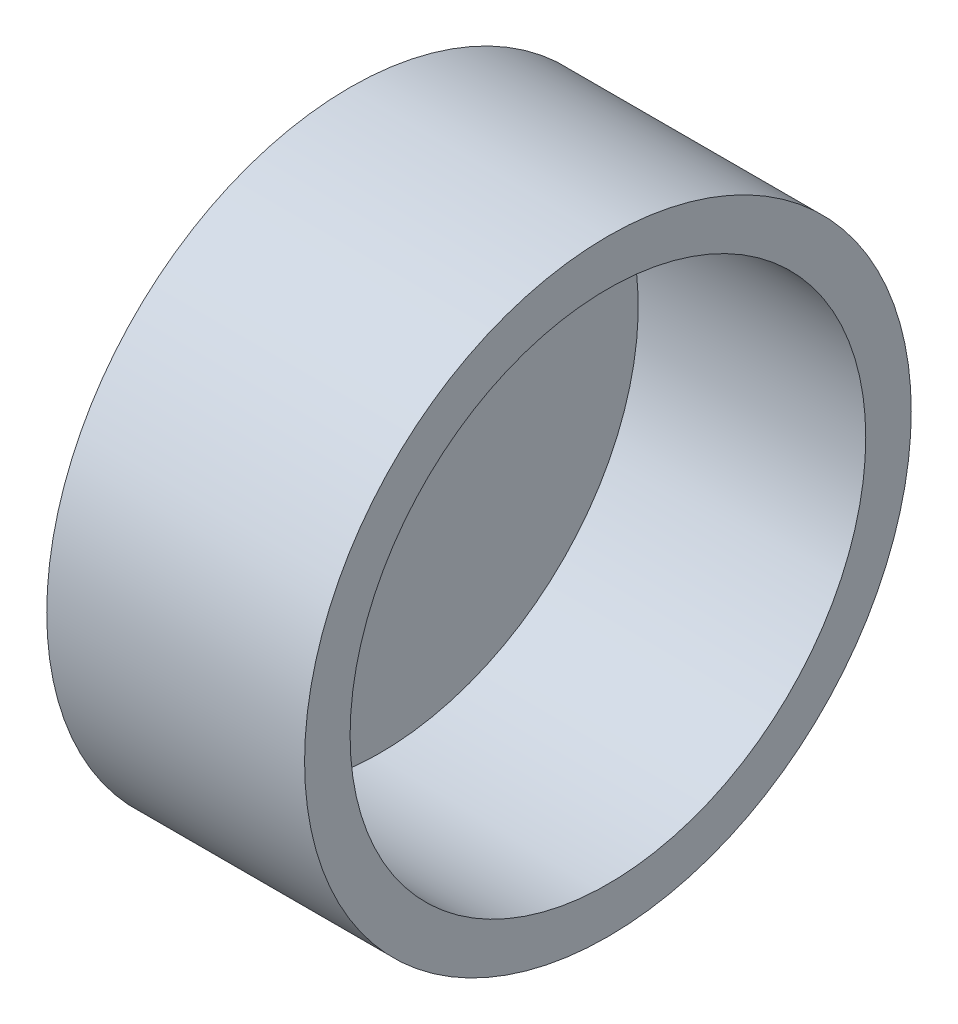
ISO-10303-21;
HEADER;
FILE_DESCRIPTION(('STEP AP214'),'2;1');
FILE_NAME('part.step','',(''),(''),'','','');
FILE_SCHEMA(('AUTOMOTIVE_DESIGN { 1 0 10303 214 1 1 1 1 }'));
ENDSEC;
DATA;
#1=APPLICATION_CONTEXT('core data for automotive mechanical design processes');
#2=APPLICATION_PROTOCOL_DEFINITION('international standard','automotive_design',2000,#1);
#3=PRODUCT_CONTEXT('',#1,'mechanical');
#4=PRODUCT('Part','Part','',(#3));
#5=PRODUCT_RELATED_PRODUCT_CATEGORY('part','',(#4));
#6=PRODUCT_DEFINITION_FORMATION('','',#4);
#7=PRODUCT_DEFINITION_CONTEXT('part definition',#1,'design');
#8=PRODUCT_DEFINITION('design','',#6,#7);
#9=PRODUCT_DEFINITION_SHAPE('','',#8);
#10=(LENGTH_UNIT() NAMED_UNIT(*) SI_UNIT(.MILLI.,.METRE.));
#11=(NAMED_UNIT(*) PLANE_ANGLE_UNIT() SI_UNIT($,.RADIAN.));
#12=(NAMED_UNIT(*) SI_UNIT($,.STERADIAN.) SOLID_ANGLE_UNIT());
#13=UNCERTAINTY_MEASURE_WITH_UNIT(LENGTH_MEASURE(1.E-05),#10,'distance_accuracy_value','');
#14=(GEOMETRIC_REPRESENTATION_CONTEXT(3) GLOBAL_UNCERTAINTY_ASSIGNED_CONTEXT((#13)) GLOBAL_UNIT_ASSIGNED_CONTEXT((#10,
#11,#12)) REPRESENTATION_CONTEXT('',''));
#15=CARTESIAN_POINT('',(0.,0.,0.));
#16=DIRECTION('',(0.,0.,1.));
#17=DIRECTION('',(1.,0.,0.));
#18=AXIS2_PLACEMENT_3D('',#15,#16,#17);
#19=CARTESIAN_POINT('',(8.5,0.,0.));
#20=DIRECTION('',(-1.,0.,0.));
#21=DIRECTION('',(0.,0.,1.));
#22=AXIS2_PLACEMENT_3D('',#19,#20,#21);
#23=CYLINDRICAL_SURFACE('',#22,8.5);
#24=CARTESIAN_POINT('',(8.5,0.,0.));
#25=DIRECTION('',(1.,0.,0.));
#26=DIRECTION('',(0.,0.,-1.));
#27=AXIS2_PLACEMENT_3D('',#24,#25,#26);
#28=CIRCLE('',#27,8.5);
#29=CARTESIAN_POINT('',(8.5,0.,-8.5));
#30=VERTEX_POINT('',#29);
#31=EDGE_CURVE('E61',#30,#30,#28,.T.);
#32=ORIENTED_EDGE('',*,*,#31,.T.);
#33=EDGE_LOOP('',(#32));
#34=FACE_BOUND('',#33,.T.);
#35=CARTESIAN_POINT('',(1.,0.,0.));
#36=DIRECTION('',(-1.,0.,0.));
#37=DIRECTION('',(0.,0.,1.));
#38=AXIS2_PLACEMENT_3D('',#35,#36,#37);
#39=CIRCLE('',#38,8.5);
#40=CARTESIAN_POINT('',(1.,0.,8.5));
#41=VERTEX_POINT('',#40);
#42=EDGE_CURVE('E67',#41,#41,#39,.T.);
#43=ORIENTED_EDGE('',*,*,#42,.T.);
#44=EDGE_LOOP('',(#43));
#45=FACE_BOUND('',#44,.T.);
#46=ADVANCED_FACE('F47',(#34,#45),#23,.F.);
#47=CARTESIAN_POINT('',(8.5,0.,0.));
#48=DIRECTION('',(1.,0.,0.));
#49=DIRECTION('',(0.,0.,-1.));
#50=AXIS2_PLACEMENT_3D('',#47,#48,#49);
#51=PLANE('',#50);
#52=CARTESIAN_POINT('',(8.5,0.,0.));
#53=DIRECTION('',(1.,0.,0.));
#54=DIRECTION('',(0.,0.,-1.));
#55=AXIS2_PLACEMENT_3D('',#52,#53,#54);
#56=CIRCLE('',#55,10.);
#57=CARTESIAN_POINT('',(8.5,0.,-10.));
#58=VERTEX_POINT('',#57);
#59=EDGE_CURVE('E11',#58,#58,#56,.T.);
#60=ORIENTED_EDGE('',*,*,#59,.T.);
#61=EDGE_LOOP('',(#60));
#62=FACE_BOUND('',#61,.T.);
#63=ORIENTED_EDGE('',*,*,#31,.F.);
#64=EDGE_LOOP('',(#63));
#65=FACE_BOUND('',#64,.T.);
#66=ADVANCED_FACE('F87',(#62,#65),#51,.T.);
#67=CARTESIAN_POINT('',(0.,0.,0.));
#68=DIRECTION('',(1.,0.,0.));
#69=DIRECTION('',(0.,0.,-1.));
#70=AXIS2_PLACEMENT_3D('',#67,#68,#69);
#71=PLANE('',#70);
#72=CARTESIAN_POINT('',(0.,0.,0.));
#73=DIRECTION('',(-1.,0.,0.));
#74=DIRECTION('',(0.,0.,1.));
#75=AXIS2_PLACEMENT_3D('',#72,#73,#74);
#76=CIRCLE('',#75,1.5);
#77=CARTESIAN_POINT('',(0.,0.,1.5));
#78=VERTEX_POINT('',#77);
#79=EDGE_CURVE('E69',#78,#78,#76,.T.);
#80=ORIENTED_EDGE('',*,*,#79,.F.);
#81=EDGE_LOOP('',(#80));
#82=FACE_BOUND('',#81,.T.);
#83=CARTESIAN_POINT('',(0.,0.,0.));
#84=DIRECTION('',(1.,0.,0.));
#85=DIRECTION('',(0.,0.,-1.));
#86=AXIS2_PLACEMENT_3D('',#83,#84,#85);
#87=CIRCLE('',#86,10.);
#88=CARTESIAN_POINT('',(0.,0.,-10.));
#89=VERTEX_POINT('',#88);
#90=EDGE_CURVE('E60',#89,#89,#87,.T.);
#91=ORIENTED_EDGE('',*,*,#90,.F.);
#92=EDGE_LOOP('',(#91));
#93=FACE_BOUND('',#92,.T.);
#94=ADVANCED_FACE('F92',(#82,#93),#71,.F.);
#95=CARTESIAN_POINT('',(8.5,0.,0.));
#96=DIRECTION('',(-1.,0.,0.));
#97=DIRECTION('',(0.,0.,1.));
#98=AXIS2_PLACEMENT_3D('',#95,#96,#97);
#99=CYLINDRICAL_SURFACE('',#98,10.);
#100=ORIENTED_EDGE('',*,*,#59,.F.);
#101=EDGE_LOOP('',(#100));
#102=FACE_BOUND('',#101,.T.);
#103=ORIENTED_EDGE('',*,*,#90,.T.);
#104=EDGE_LOOP('',(#103));
#105=FACE_BOUND('',#104,.T.);
#106=ADVANCED_FACE('F51',(#102,#105),#99,.T.);
#107=CARTESIAN_POINT('',(1.,0.,0.));
#108=DIRECTION('',(-1.,0.,0.));
#109=DIRECTION('',(0.,0.,1.));
#110=AXIS2_PLACEMENT_3D('',#107,#108,#109);
#111=PLANE('',#110);
#112=CARTESIAN_POINT('',(1.,0.,0.));
#113=DIRECTION('',(-1.,0.,0.));
#114=DIRECTION('',(0.,0.,1.));
#115=AXIS2_PLACEMENT_3D('',#112,#113,#114);
#116=CIRCLE('',#115,1.5);
#117=CARTESIAN_POINT('',(1.,0.,1.5));
#118=VERTEX_POINT('',#117);
#119=EDGE_CURVE('E52',#118,#118,#116,.T.);
#120=ORIENTED_EDGE('',*,*,#119,.T.);
#121=EDGE_LOOP('',(#120));
#122=FACE_BOUND('',#121,.T.);
#123=ORIENTED_EDGE('',*,*,#42,.F.);
#124=EDGE_LOOP('',(#123));
#125=FACE_BOUND('',#124,.T.);
#126=ADVANCED_FACE('F79',(#122,#125),#111,.F.);
#127=CARTESIAN_POINT('',(8.5,0.,0.));
#128=DIRECTION('',(-1.,0.,0.));
#129=DIRECTION('',(0.,0.,1.));
#130=AXIS2_PLACEMENT_3D('',#127,#128,#129);
#131=CYLINDRICAL_SURFACE('',#130,1.5);
#132=ORIENTED_EDGE('',*,*,#79,.T.);
#133=EDGE_LOOP('',(#132));
#134=FACE_BOUND('',#133,.T.);
#135=ORIENTED_EDGE('',*,*,#119,.F.);
#136=EDGE_LOOP('',(#135));
#137=FACE_BOUND('',#136,.T.);
#138=ADVANCED_FACE('F78',(#134,#137),#131,.F.);
#139=CLOSED_SHELL('',(#46,#66,#94,#106,#126,#138));
#140=MANIFOLD_SOLID_BREP('B2',#139);
#141=ADVANCED_BREP_SHAPE_REPRESENTATION('',(#18,#140),#14);
#142=SHAPE_DEFINITION_REPRESENTATION(#9,#141);
ENDSEC;
END-ISO-10303-21;
